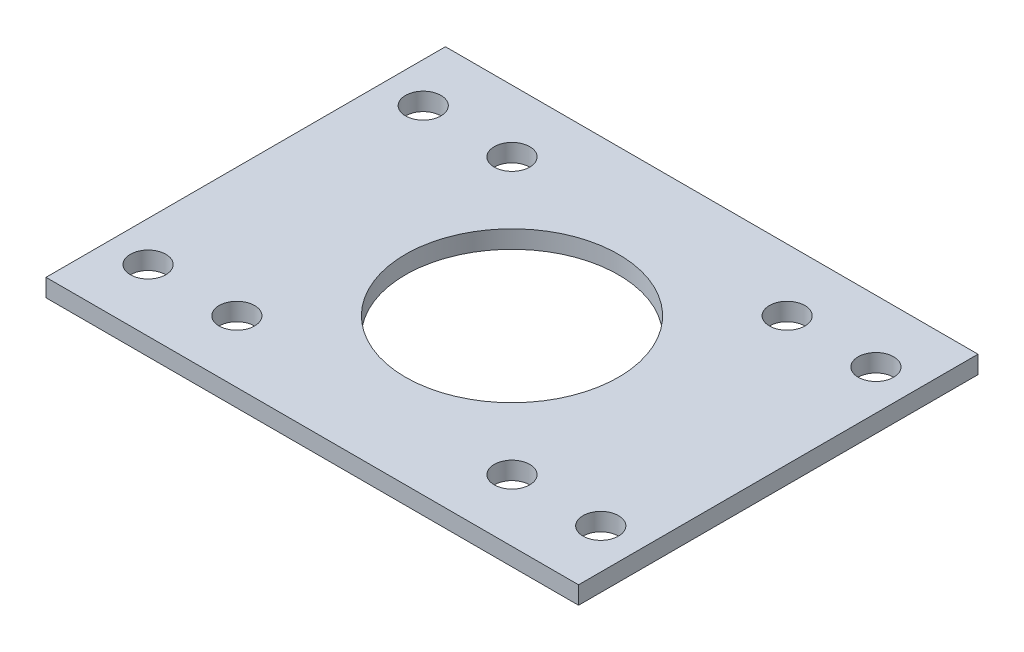
ISO-10303-21;
HEADER;
FILE_DESCRIPTION(('STEP AP214'),'2;1');
FILE_NAME('part.step','',(''),(''),'','','');
FILE_SCHEMA(('AUTOMOTIVE_DESIGN { 1 0 10303 214 1 1 1 1 }'));
ENDSEC;
DATA;
#1=APPLICATION_CONTEXT('core data for automotive mechanical design processes');
#2=APPLICATION_PROTOCOL_DEFINITION('international standard','automotive_design',2000,#1);
#3=PRODUCT_CONTEXT('',#1,'mechanical');
#4=PRODUCT('Part','Part','',(#3));
#5=PRODUCT_RELATED_PRODUCT_CATEGORY('part','',(#4));
#6=PRODUCT_DEFINITION_FORMATION('','',#4);
#7=PRODUCT_DEFINITION_CONTEXT('part definition',#1,'design');
#8=PRODUCT_DEFINITION('design','',#6,#7);
#9=PRODUCT_DEFINITION_SHAPE('','',#8);
#10=(LENGTH_UNIT() NAMED_UNIT(*) SI_UNIT(.MILLI.,.METRE.));
#11=(NAMED_UNIT(*) PLANE_ANGLE_UNIT() SI_UNIT($,.RADIAN.));
#12=(NAMED_UNIT(*) SI_UNIT($,.STERADIAN.) SOLID_ANGLE_UNIT());
#13=UNCERTAINTY_MEASURE_WITH_UNIT(LENGTH_MEASURE(1.E-05),#10,'distance_accuracy_value','');
#14=(GEOMETRIC_REPRESENTATION_CONTEXT(3) GLOBAL_UNCERTAINTY_ASSIGNED_CONTEXT((#13)) GLOBAL_UNIT_ASSIGNED_CONTEXT((#10,
#11,#12)) REPRESENTATION_CONTEXT('',''));
#15=CARTESIAN_POINT('',(0.,0.,0.));
#16=DIRECTION('',(0.,0.,1.));
#17=DIRECTION('',(1.,0.,0.));
#18=AXIS2_PLACEMENT_3D('',#15,#16,#17);
#19=CARTESIAN_POINT('',(0.,2.,0.));
#20=DIRECTION('',(0.,1.,0.));
#21=DIRECTION('',(0.,0.,1.));
#22=AXIS2_PLACEMENT_3D('',#19,#20,#21);
#23=PLANE('',#22);
#24=CARTESIAN_POINT('',(0.,2.,0.));
#25=DIRECTION('',(0.,1.,0.));
#26=DIRECTION('',(0.,0.,1.));
#27=AXIS2_PLACEMENT_3D('',#24,#25,#26);
#28=CIRCLE('',#27,12.);
#29=CARTESIAN_POINT('',(0.,2.,12.));
#30=VERTEX_POINT('',#29);
#31=EDGE_CURVE('E159',#30,#30,#28,.T.);
#32=ORIENTED_EDGE('',*,*,#31,.F.);
#33=EDGE_LOOP('',(#32));
#34=FACE_BOUND('',#33,.T.);
#35=CARTESIAN_POINT('',(25.5,2.,15.5));
#36=DIRECTION('',(0.,1.,0.));
#37=DIRECTION('',(0.,0.,1.));
#38=AXIS2_PLACEMENT_3D('',#35,#36,#37);
#39=CIRCLE('',#38,2.);
#40=CARTESIAN_POINT('',(25.5,2.,17.5));
#41=VERTEX_POINT('',#40);
#42=EDGE_CURVE('E144',#41,#41,#39,.T.);
#43=ORIENTED_EDGE('',*,*,#42,.F.);
#44=EDGE_LOOP('',(#43));
#45=FACE_BOUND('',#44,.T.);
#46=CARTESIAN_POINT('',(-25.5,2.,-15.5));
#47=DIRECTION('',(0.,1.,0.));
#48=DIRECTION('',(0.,0.,1.));
#49=AXIS2_PLACEMENT_3D('',#46,#47,#48);
#50=CIRCLE('',#49,2.);
#51=CARTESIAN_POINT('',(-25.5,2.,-13.5));
#52=VERTEX_POINT('',#51);
#53=EDGE_CURVE('E132',#52,#52,#50,.T.);
#54=ORIENTED_EDGE('',*,*,#53,.F.);
#55=EDGE_LOOP('',(#54));
#56=FACE_BOUND('',#55,.T.);
#57=CARTESIAN_POINT('',(15.5,2.,15.5));
#58=DIRECTION('',(0.,1.,0.));
#59=DIRECTION('',(0.,0.,1.));
#60=AXIS2_PLACEMENT_3D('',#57,#58,#59);
#61=CIRCLE('',#60,2.);
#62=CARTESIAN_POINT('',(15.5,2.,17.5));
#63=VERTEX_POINT('',#62);
#64=EDGE_CURVE('E120',#63,#63,#61,.T.);
#65=ORIENTED_EDGE('',*,*,#64,.F.);
#66=EDGE_LOOP('',(#65));
#67=FACE_BOUND('',#66,.T.);
#68=CARTESIAN_POINT('',(-15.5,2.,-15.5));
#69=DIRECTION('',(0.,1.,0.));
#70=DIRECTION('',(0.,0.,1.));
#71=AXIS2_PLACEMENT_3D('',#68,#69,#70);
#72=CIRCLE('',#71,2.);
#73=CARTESIAN_POINT('',(-15.5,2.,-13.5));
#74=VERTEX_POINT('',#73);
#75=EDGE_CURVE('E99',#74,#74,#72,.T.);
#76=ORIENTED_EDGE('',*,*,#75,.F.);
#77=EDGE_LOOP('',(#76));
#78=FACE_BOUND('',#77,.T.);
#79=DIRECTION('',(0.,0.,-1.));
#80=VECTOR('',#79,1.);
#81=CARTESIAN_POINT('',(30.,2.,-22.5));
#82=LINE('',#81,#80);
#83=CARTESIAN_POINT('',(30.,2.,22.5));
#84=VERTEX_POINT('',#83);
#85=CARTESIAN_POINT('',(30.,2.,-22.5));
#86=VERTEX_POINT('',#85);
#87=EDGE_CURVE('E84',#84,#86,#82,.T.);
#88=ORIENTED_EDGE('',*,*,#87,.T.);
#89=DIRECTION('',(-1.,0.,0.));
#90=VECTOR('',#89,1.);
#91=CARTESIAN_POINT('',(-30.,2.,-22.5));
#92=LINE('',#91,#90);
#93=CARTESIAN_POINT('',(-30.,2.,-22.5));
#94=VERTEX_POINT('',#93);
#95=EDGE_CURVE('E79',#86,#94,#92,.T.);
#96=ORIENTED_EDGE('',*,*,#95,.T.);
#97=DIRECTION('',(0.,0.,1.));
#98=VECTOR('',#97,1.);
#99=CARTESIAN_POINT('',(-30.,2.,-22.5));
#100=LINE('',#99,#98);
#101=CARTESIAN_POINT('',(-30.,2.,22.5));
#102=VERTEX_POINT('',#101);
#103=EDGE_CURVE('E82',#94,#102,#100,.T.);
#104=ORIENTED_EDGE('',*,*,#103,.T.);
#105=DIRECTION('',(1.,0.,0.));
#106=VECTOR('',#105,1.);
#107=CARTESIAN_POINT('',(-30.,2.,22.5));
#108=LINE('',#107,#106);
#109=EDGE_CURVE('E49',#102,#84,#108,.T.);
#110=ORIENTED_EDGE('',*,*,#109,.T.);
#111=EDGE_LOOP('',(#88,#96,#104,#110));
#112=FACE_BOUND('',#111,.T.);
#113=CARTESIAN_POINT('',(15.5,2.,-15.5));
#114=DIRECTION('',(0.,1.,0.));
#115=DIRECTION('',(0.,0.,1.));
#116=AXIS2_PLACEMENT_3D('',#113,#114,#115);
#117=CIRCLE('',#116,2.);
#118=CARTESIAN_POINT('',(15.5,2.,-13.5));
#119=VERTEX_POINT('',#118);
#120=EDGE_CURVE('E114',#119,#119,#117,.T.);
#121=ORIENTED_EDGE('',*,*,#120,.F.);
#122=EDGE_LOOP('',(#121));
#123=FACE_BOUND('',#122,.T.);
#124=CARTESIAN_POINT('',(-15.5,2.,15.5));
#125=DIRECTION('',(0.,1.,0.));
#126=DIRECTION('',(0.,0.,1.));
#127=AXIS2_PLACEMENT_3D('',#124,#125,#126);
#128=CIRCLE('',#127,2.);
#129=CARTESIAN_POINT('',(-15.5,2.,17.5));
#130=VERTEX_POINT('',#129);
#131=EDGE_CURVE('E126',#130,#130,#128,.T.);
#132=ORIENTED_EDGE('',*,*,#131,.F.);
#133=EDGE_LOOP('',(#132));
#134=FACE_BOUND('',#133,.T.);
#135=CARTESIAN_POINT('',(-25.5,2.,15.5));
#136=DIRECTION('',(0.,1.,0.));
#137=DIRECTION('',(0.,0.,1.));
#138=AXIS2_PLACEMENT_3D('',#135,#136,#137);
#139=CIRCLE('',#138,2.);
#140=CARTESIAN_POINT('',(-25.5,2.,17.5));
#141=VERTEX_POINT('',#140);
#142=EDGE_CURVE('E138',#141,#141,#139,.T.);
#143=ORIENTED_EDGE('',*,*,#142,.F.);
#144=EDGE_LOOP('',(#143));
#145=FACE_BOUND('',#144,.T.);
#146=CARTESIAN_POINT('',(25.5,2.,-15.5));
#147=DIRECTION('',(0.,1.,0.));
#148=DIRECTION('',(0.,0.,1.));
#149=AXIS2_PLACEMENT_3D('',#146,#147,#148);
#150=CIRCLE('',#149,2.00000000000001);
#151=CARTESIAN_POINT('',(25.5,2.,-13.5));
#152=VERTEX_POINT('',#151);
#153=EDGE_CURVE('E150',#152,#152,#150,.T.);
#154=ORIENTED_EDGE('',*,*,#153,.F.);
#155=EDGE_LOOP('',(#154));
#156=FACE_BOUND('',#155,.T.);
#157=ADVANCED_FACE('F32',(#34,#45,#56,#67,#78,#112,#123,#134,#145,#156),#23,.T.);
#158=CARTESIAN_POINT('',(0.,0.,0.));
#159=DIRECTION('',(0.,1.,0.));
#160=DIRECTION('',(0.,0.,1.));
#161=AXIS2_PLACEMENT_3D('',#158,#159,#160);
#162=PLANE('',#161);
#163=CARTESIAN_POINT('',(0.,0.,0.));
#164=DIRECTION('',(0.,1.,0.));
#165=DIRECTION('',(0.,0.,1.));
#166=AXIS2_PLACEMENT_3D('',#163,#164,#165);
#167=CIRCLE('',#166,12.);
#168=CARTESIAN_POINT('',(0.,0.,12.));
#169=VERTEX_POINT('',#168);
#170=EDGE_CURVE('E156',#169,#169,#167,.T.);
#171=ORIENTED_EDGE('',*,*,#170,.T.);
#172=EDGE_LOOP('',(#171));
#173=FACE_BOUND('',#172,.T.);
#174=DIRECTION('',(0.,0.,-1.));
#175=VECTOR('',#174,1.);
#176=CARTESIAN_POINT('',(30.,0.,-22.5));
#177=LINE('',#176,#175);
#178=CARTESIAN_POINT('',(30.,0.,22.5));
#179=VERTEX_POINT('',#178);
#180=CARTESIAN_POINT('',(30.,0.,-22.5));
#181=VERTEX_POINT('',#180);
#182=EDGE_CURVE('E96',#179,#181,#177,.T.);
#183=ORIENTED_EDGE('',*,*,#182,.F.);
#184=DIRECTION('',(1.,0.,0.));
#185=VECTOR('',#184,1.);
#186=CARTESIAN_POINT('',(-30.,0.,22.5));
#187=LINE('',#186,#185);
#188=CARTESIAN_POINT('',(-30.,0.,22.5));
#189=VERTEX_POINT('',#188);
#190=EDGE_CURVE('E72',#189,#179,#187,.T.);
#191=ORIENTED_EDGE('',*,*,#190,.F.);
#192=DIRECTION('',(0.,0.,1.));
#193=VECTOR('',#192,1.);
#194=CARTESIAN_POINT('',(-30.,0.,-22.5));
#195=LINE('',#194,#193);
#196=CARTESIAN_POINT('',(-30.,0.,-22.5));
#197=VERTEX_POINT('',#196);
#198=EDGE_CURVE('E66',#197,#189,#195,.T.);
#199=ORIENTED_EDGE('',*,*,#198,.F.);
#200=DIRECTION('',(-1.,0.,0.));
#201=VECTOR('',#200,1.);
#202=CARTESIAN_POINT('',(-30.,0.,-22.5));
#203=LINE('',#202,#201);
#204=EDGE_CURVE('E88',#181,#197,#203,.T.);
#205=ORIENTED_EDGE('',*,*,#204,.F.);
#206=EDGE_LOOP('',(#183,#191,#199,#205));
#207=FACE_BOUND('',#206,.T.);
#208=CARTESIAN_POINT('',(-15.5,0.,-15.5));
#209=DIRECTION('',(0.,1.,0.));
#210=DIRECTION('',(0.,0.,1.));
#211=AXIS2_PLACEMENT_3D('',#208,#209,#210);
#212=CIRCLE('',#211,2.);
#213=CARTESIAN_POINT('',(-15.5,0.,-13.5));
#214=VERTEX_POINT('',#213);
#215=EDGE_CURVE('E111',#214,#214,#212,.T.);
#216=ORIENTED_EDGE('',*,*,#215,.T.);
#217=EDGE_LOOP('',(#216));
#218=FACE_BOUND('',#217,.T.);
#219=CARTESIAN_POINT('',(15.5,0.,-15.5));
#220=DIRECTION('',(0.,1.,0.));
#221=DIRECTION('',(0.,0.,1.));
#222=AXIS2_PLACEMENT_3D('',#219,#220,#221);
#223=CIRCLE('',#222,2.);
#224=CARTESIAN_POINT('',(15.5,0.,-13.5));
#225=VERTEX_POINT('',#224);
#226=EDGE_CURVE('E117',#225,#225,#223,.T.);
#227=ORIENTED_EDGE('',*,*,#226,.T.);
#228=EDGE_LOOP('',(#227));
#229=FACE_BOUND('',#228,.T.);
#230=CARTESIAN_POINT('',(15.5,0.,15.5));
#231=DIRECTION('',(0.,1.,0.));
#232=DIRECTION('',(0.,0.,1.));
#233=AXIS2_PLACEMENT_3D('',#230,#231,#232);
#234=CIRCLE('',#233,2.);
#235=CARTESIAN_POINT('',(15.5,0.,17.5));
#236=VERTEX_POINT('',#235);
#237=EDGE_CURVE('E123',#236,#236,#234,.T.);
#238=ORIENTED_EDGE('',*,*,#237,.T.);
#239=EDGE_LOOP('',(#238));
#240=FACE_BOUND('',#239,.T.);
#241=CARTESIAN_POINT('',(-15.5,0.,15.5));
#242=DIRECTION('',(0.,1.,0.));
#243=DIRECTION('',(0.,0.,1.));
#244=AXIS2_PLACEMENT_3D('',#241,#242,#243);
#245=CIRCLE('',#244,2.);
#246=CARTESIAN_POINT('',(-15.5,0.,17.5));
#247=VERTEX_POINT('',#246);
#248=EDGE_CURVE('E129',#247,#247,#245,.T.);
#249=ORIENTED_EDGE('',*,*,#248,.T.);
#250=EDGE_LOOP('',(#249));
#251=FACE_BOUND('',#250,.T.);
#252=CARTESIAN_POINT('',(-25.5,0.,-15.5));
#253=DIRECTION('',(0.,1.,0.));
#254=DIRECTION('',(0.,0.,1.));
#255=AXIS2_PLACEMENT_3D('',#252,#253,#254);
#256=CIRCLE('',#255,2.);
#257=CARTESIAN_POINT('',(-25.5,0.,-13.5));
#258=VERTEX_POINT('',#257);
#259=EDGE_CURVE('E135',#258,#258,#256,.T.);
#260=ORIENTED_EDGE('',*,*,#259,.T.);
#261=EDGE_LOOP('',(#260));
#262=FACE_BOUND('',#261,.T.);
#263=CARTESIAN_POINT('',(-25.5,0.,15.5));
#264=DIRECTION('',(0.,1.,0.));
#265=DIRECTION('',(0.,0.,1.));
#266=AXIS2_PLACEMENT_3D('',#263,#264,#265);
#267=CIRCLE('',#266,2.);
#268=CARTESIAN_POINT('',(-25.5,0.,17.5));
#269=VERTEX_POINT('',#268);
#270=EDGE_CURVE('E141',#269,#269,#267,.T.);
#271=ORIENTED_EDGE('',*,*,#270,.T.);
#272=EDGE_LOOP('',(#271));
#273=FACE_BOUND('',#272,.T.);
#274=CARTESIAN_POINT('',(25.5,0.,15.5));
#275=DIRECTION('',(0.,1.,0.));
#276=DIRECTION('',(0.,0.,1.));
#277=AXIS2_PLACEMENT_3D('',#274,#275,#276);
#278=CIRCLE('',#277,2.);
#279=CARTESIAN_POINT('',(25.5,0.,17.5));
#280=VERTEX_POINT('',#279);
#281=EDGE_CURVE('E147',#280,#280,#278,.T.);
#282=ORIENTED_EDGE('',*,*,#281,.T.);
#283=EDGE_LOOP('',(#282));
#284=FACE_BOUND('',#283,.T.);
#285=CARTESIAN_POINT('',(25.5,0.,-15.5));
#286=DIRECTION('',(0.,1.,0.));
#287=DIRECTION('',(0.,0.,1.));
#288=AXIS2_PLACEMENT_3D('',#285,#286,#287);
#289=CIRCLE('',#288,2.00000000000001);
#290=CARTESIAN_POINT('',(25.5,0.,-13.5));
#291=VERTEX_POINT('',#290);
#292=EDGE_CURVE('E153',#291,#291,#289,.T.);
#293=ORIENTED_EDGE('',*,*,#292,.T.);
#294=EDGE_LOOP('',(#293));
#295=FACE_BOUND('',#294,.T.);
#296=ADVANCED_FACE('F107',(#173,#207,#218,#229,#240,#251,#262,#273,#284,#295),#162,.F.);
#297=CARTESIAN_POINT('',(30.,2.,-22.5));
#298=DIRECTION('',(-1.,0.,0.));
#299=DIRECTION('',(0.,0.,1.));
#300=AXIS2_PLACEMENT_3D('',#297,#298,#299);
#301=PLANE('',#300);
#302=ORIENTED_EDGE('',*,*,#182,.T.);
#303=DIRECTION('',(0.,-1.,0.));
#304=VECTOR('',#303,1.);
#305=CARTESIAN_POINT('',(30.,2.,-22.5));
#306=LINE('',#305,#304);
#307=EDGE_CURVE('E11',#86,#181,#306,.T.);
#308=ORIENTED_EDGE('',*,*,#307,.F.);
#309=ORIENTED_EDGE('',*,*,#87,.F.);
#310=DIRECTION('',(0.,-1.,0.));
#311=VECTOR('',#310,1.);
#312=CARTESIAN_POINT('',(30.,2.,22.5));
#313=LINE('',#312,#311);
#314=EDGE_CURVE('E92',#84,#179,#313,.T.);
#315=ORIENTED_EDGE('',*,*,#314,.T.);
#316=EDGE_LOOP('',(#302,#308,#309,#315));
#317=FACE_BOUND('',#316,.T.);
#318=ADVANCED_FACE('F34',(#317),#301,.F.);
#319=CARTESIAN_POINT('',(-30.,2.,-22.5));
#320=DIRECTION('',(0.,0.,1.));
#321=DIRECTION('',(1.,0.,0.));
#322=AXIS2_PLACEMENT_3D('',#319,#320,#321);
#323=PLANE('',#322);
#324=ORIENTED_EDGE('',*,*,#204,.T.);
#325=DIRECTION('',(0.,-1.,0.));
#326=VECTOR('',#325,1.);
#327=CARTESIAN_POINT('',(-30.,2.,-22.5));
#328=LINE('',#327,#326);
#329=EDGE_CURVE('E41',#94,#197,#328,.T.);
#330=ORIENTED_EDGE('',*,*,#329,.F.);
#331=ORIENTED_EDGE('',*,*,#95,.F.);
#332=ORIENTED_EDGE('',*,*,#307,.T.);
#333=EDGE_LOOP('',(#324,#330,#331,#332));
#334=FACE_BOUND('',#333,.T.);
#335=ADVANCED_FACE('F87',(#334),#323,.F.);
#336=CARTESIAN_POINT('',(-30.,2.,-22.5));
#337=DIRECTION('',(1.,0.,0.));
#338=DIRECTION('',(0.,0.,-1.));
#339=AXIS2_PLACEMENT_3D('',#336,#337,#338);
#340=PLANE('',#339);
#341=ORIENTED_EDGE('',*,*,#198,.T.);
#342=DIRECTION('',(0.,-1.,0.));
#343=VECTOR('',#342,1.);
#344=CARTESIAN_POINT('',(-30.,2.,22.5));
#345=LINE('',#344,#343);
#346=EDGE_CURVE('E89',#102,#189,#345,.T.);
#347=ORIENTED_EDGE('',*,*,#346,.F.);
#348=ORIENTED_EDGE('',*,*,#103,.F.);
#349=ORIENTED_EDGE('',*,*,#329,.T.);
#350=EDGE_LOOP('',(#341,#347,#348,#349));
#351=FACE_BOUND('',#350,.T.);
#352=ADVANCED_FACE('F90',(#351),#340,.F.);
#353=CARTESIAN_POINT('',(-30.,2.,22.5));
#354=DIRECTION('',(0.,0.,-1.));
#355=DIRECTION('',(-1.,0.,0.));
#356=AXIS2_PLACEMENT_3D('',#353,#354,#355);
#357=PLANE('',#356);
#358=ORIENTED_EDGE('',*,*,#190,.T.);
#359=ORIENTED_EDGE('',*,*,#314,.F.);
#360=ORIENTED_EDGE('',*,*,#109,.F.);
#361=ORIENTED_EDGE('',*,*,#346,.T.);
#362=EDGE_LOOP('',(#358,#359,#360,#361));
#363=FACE_BOUND('',#362,.T.);
#364=ADVANCED_FACE('F104',(#363),#357,.F.);
#365=CARTESIAN_POINT('',(-15.5,2.,-15.5));
#366=DIRECTION('',(0.,-1.,0.));
#367=DIRECTION('',(0.,0.,-1.));
#368=AXIS2_PLACEMENT_3D('',#365,#366,#367);
#369=CYLINDRICAL_SURFACE('',#368,2.);
#370=ORIENTED_EDGE('',*,*,#75,.T.);
#371=EDGE_LOOP('',(#370));
#372=FACE_BOUND('',#371,.T.);
#373=ORIENTED_EDGE('',*,*,#215,.F.);
#374=EDGE_LOOP('',(#373));
#375=FACE_BOUND('',#374,.T.);
#376=ADVANCED_FACE('F184',(#372,#375),#369,.F.);
#377=CARTESIAN_POINT('',(15.5,2.,-15.5));
#378=DIRECTION('',(0.,-1.,0.));
#379=DIRECTION('',(0.,0.,-1.));
#380=AXIS2_PLACEMENT_3D('',#377,#378,#379);
#381=CYLINDRICAL_SURFACE('',#380,2.);
#382=ORIENTED_EDGE('',*,*,#120,.T.);
#383=EDGE_LOOP('',(#382));
#384=FACE_BOUND('',#383,.T.);
#385=ORIENTED_EDGE('',*,*,#226,.F.);
#386=EDGE_LOOP('',(#385));
#387=FACE_BOUND('',#386,.T.);
#388=ADVANCED_FACE('F187',(#384,#387),#381,.F.);
#389=CARTESIAN_POINT('',(15.5,2.,15.5));
#390=DIRECTION('',(0.,-1.,0.));
#391=DIRECTION('',(0.,0.,-1.));
#392=AXIS2_PLACEMENT_3D('',#389,#390,#391);
#393=CYLINDRICAL_SURFACE('',#392,2.);
#394=ORIENTED_EDGE('',*,*,#64,.T.);
#395=EDGE_LOOP('',(#394));
#396=FACE_BOUND('',#395,.T.);
#397=ORIENTED_EDGE('',*,*,#237,.F.);
#398=EDGE_LOOP('',(#397));
#399=FACE_BOUND('',#398,.T.);
#400=ADVANCED_FACE('F228',(#396,#399),#393,.F.);
#401=CARTESIAN_POINT('',(-15.5,2.,15.5));
#402=DIRECTION('',(0.,-1.,0.));
#403=DIRECTION('',(0.,0.,-1.));
#404=AXIS2_PLACEMENT_3D('',#401,#402,#403);
#405=CYLINDRICAL_SURFACE('',#404,2.);
#406=ORIENTED_EDGE('',*,*,#131,.T.);
#407=EDGE_LOOP('',(#406));
#408=FACE_BOUND('',#407,.T.);
#409=ORIENTED_EDGE('',*,*,#248,.F.);
#410=EDGE_LOOP('',(#409));
#411=FACE_BOUND('',#410,.T.);
#412=ADVANCED_FACE('F224',(#408,#411),#405,.F.);
#413=CARTESIAN_POINT('',(-25.5,2.,-15.5));
#414=DIRECTION('',(0.,-1.,0.));
#415=DIRECTION('',(0.,0.,-1.));
#416=AXIS2_PLACEMENT_3D('',#413,#414,#415);
#417=CYLINDRICAL_SURFACE('',#416,2.);
#418=ORIENTED_EDGE('',*,*,#53,.T.);
#419=EDGE_LOOP('',(#418));
#420=FACE_BOUND('',#419,.T.);
#421=ORIENTED_EDGE('',*,*,#259,.F.);
#422=EDGE_LOOP('',(#421));
#423=FACE_BOUND('',#422,.T.);
#424=ADVANCED_FACE('F220',(#420,#423),#417,.F.);
#425=CARTESIAN_POINT('',(-25.5,2.,15.5));
#426=DIRECTION('',(0.,-1.,0.));
#427=DIRECTION('',(0.,0.,-1.));
#428=AXIS2_PLACEMENT_3D('',#425,#426,#427);
#429=CYLINDRICAL_SURFACE('',#428,2.);
#430=ORIENTED_EDGE('',*,*,#142,.T.);
#431=EDGE_LOOP('',(#430));
#432=FACE_BOUND('',#431,.T.);
#433=ORIENTED_EDGE('',*,*,#270,.F.);
#434=EDGE_LOOP('',(#433));
#435=FACE_BOUND('',#434,.T.);
#436=ADVANCED_FACE('F214',(#432,#435),#429,.F.);
#437=CARTESIAN_POINT('',(25.5,2.,15.5));
#438=DIRECTION('',(0.,-1.,0.));
#439=DIRECTION('',(0.,0.,-1.));
#440=AXIS2_PLACEMENT_3D('',#437,#438,#439);
#441=CYLINDRICAL_SURFACE('',#440,2.);
#442=ORIENTED_EDGE('',*,*,#42,.T.);
#443=EDGE_LOOP('',(#442));
#444=FACE_BOUND('',#443,.T.);
#445=ORIENTED_EDGE('',*,*,#281,.F.);
#446=EDGE_LOOP('',(#445));
#447=FACE_BOUND('',#446,.T.);
#448=ADVANCED_FACE('F208',(#444,#447),#441,.F.);
#449=CARTESIAN_POINT('',(25.5,2.,-15.5));
#450=DIRECTION('',(0.,-1.,0.));
#451=DIRECTION('',(0.,0.,-1.));
#452=AXIS2_PLACEMENT_3D('',#449,#450,#451);
#453=CYLINDRICAL_SURFACE('',#452,2.00000000000001);
#454=ORIENTED_EDGE('',*,*,#153,.T.);
#455=EDGE_LOOP('',(#454));
#456=FACE_BOUND('',#455,.T.);
#457=ORIENTED_EDGE('',*,*,#292,.F.);
#458=EDGE_LOOP('',(#457));
#459=FACE_BOUND('',#458,.T.);
#460=ADVANCED_FACE('F169',(#456,#459),#453,.F.);
#461=CARTESIAN_POINT('',(0.,0.,0.));
#462=DIRECTION('',(0.,1.,0.));
#463=DIRECTION('',(0.,0.,1.));
#464=AXIS2_PLACEMENT_3D('',#461,#462,#463);
#465=CYLINDRICAL_SURFACE('',#464,12.);
#466=ORIENTED_EDGE('',*,*,#170,.F.);
#467=EDGE_LOOP('',(#466));
#468=FACE_BOUND('',#467,.T.);
#469=ORIENTED_EDGE('',*,*,#31,.T.);
#470=EDGE_LOOP('',(#469));
#471=FACE_BOUND('',#470,.T.);
#472=ADVANCED_FACE('F166',(#468,#471),#465,.F.);
#473=CLOSED_SHELL('',(#157,#296,#318,#335,#352,#364,#376,#388,#400,#412,#424,#436,#448,#460,#472));
#474=MANIFOLD_SOLID_BREP('B2',#473);
#475=ADVANCED_BREP_SHAPE_REPRESENTATION('',(#18,#474),#14);
#476=SHAPE_DEFINITION_REPRESENTATION(#9,#475);
ENDSEC;
END-ISO-10303-21;
